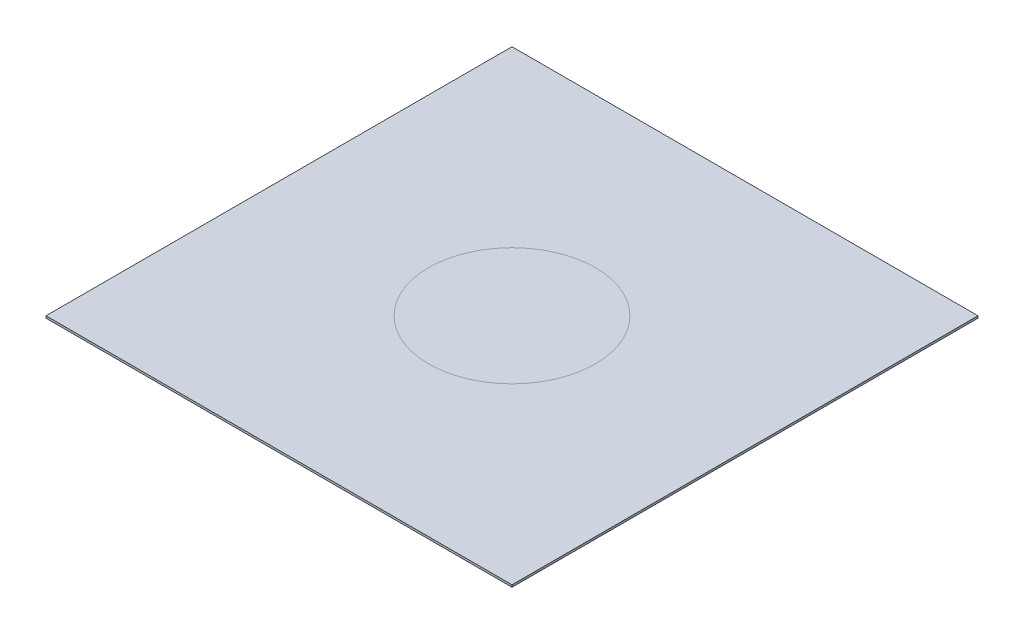
ISO-10303-21;
HEADER;
FILE_DESCRIPTION(('STEP AP214'),'2;1');
FILE_NAME('part.step','',(''),(''),'','','');
FILE_SCHEMA(('AUTOMOTIVE_DESIGN { 1 0 10303 214 1 1 1 1 }'));
ENDSEC;
DATA;
#1=APPLICATION_CONTEXT('core data for automotive mechanical design processes');
#2=APPLICATION_PROTOCOL_DEFINITION('international standard','automotive_design',2000,#1);
#3=PRODUCT_CONTEXT('',#1,'mechanical');
#4=PRODUCT('Part','Part','',(#3));
#5=PRODUCT_RELATED_PRODUCT_CATEGORY('part','',(#4));
#6=PRODUCT_DEFINITION_FORMATION('','',#4);
#7=PRODUCT_DEFINITION_CONTEXT('part definition',#1,'design');
#8=PRODUCT_DEFINITION('design','',#6,#7);
#9=PRODUCT_DEFINITION_SHAPE('','',#8);
#10=(LENGTH_UNIT() NAMED_UNIT(*) SI_UNIT(.MILLI.,.METRE.));
#11=(NAMED_UNIT(*) PLANE_ANGLE_UNIT() SI_UNIT($,.RADIAN.));
#12=(NAMED_UNIT(*) SI_UNIT($,.STERADIAN.) SOLID_ANGLE_UNIT());
#13=UNCERTAINTY_MEASURE_WITH_UNIT(LENGTH_MEASURE(1.E-05),#10,'distance_accuracy_value','');
#14=(GEOMETRIC_REPRESENTATION_CONTEXT(3) GLOBAL_UNCERTAINTY_ASSIGNED_CONTEXT((#13)) GLOBAL_UNIT_ASSIGNED_CONTEXT((#10,
#11,#12)) REPRESENTATION_CONTEXT('',''));
#15=CARTESIAN_POINT('',(0.,0.,0.));
#16=DIRECTION('',(0.,0.,1.));
#17=DIRECTION('',(1.,0.,0.));
#18=AXIS2_PLACEMENT_3D('',#15,#16,#17);
#19=CARTESIAN_POINT('',(0.,0.32,0.));
#20=DIRECTION('',(0.,-1.,0.));
#21=DIRECTION('',(0.,0.,-1.));
#22=AXIS2_PLACEMENT_3D('',#19,#20,#21);
#23=PLANE('',#22);
#24=DIRECTION('',(0.,0.,-1.));
#25=VECTOR('',#24,1.);
#26=CARTESIAN_POINT('',(69.85,0.32,69.85));
#27=LINE('',#26,#25);
#28=CARTESIAN_POINT('',(69.85,0.32,69.85));
#29=VERTEX_POINT('',#28);
#30=CARTESIAN_POINT('',(69.85,0.32,-69.85));
#31=VERTEX_POINT('',#30);
#32=EDGE_CURVE('E96',#29,#31,#27,.T.);
#33=ORIENTED_EDGE('',*,*,#32,.T.);
#34=DIRECTION('',(-1.,0.,0.));
#35=VECTOR('',#34,1.);
#36=CARTESIAN_POINT('',(-69.85,0.32,-69.85));
#37=LINE('',#36,#35);
#38=CARTESIAN_POINT('',(-69.85,0.32,-69.85));
#39=VERTEX_POINT('',#38);
#40=EDGE_CURVE('E91',#31,#39,#37,.T.);
#41=ORIENTED_EDGE('',*,*,#40,.T.);
#42=DIRECTION('',(0.,0.,1.));
#43=VECTOR('',#42,1.);
#44=CARTESIAN_POINT('',(-69.85,0.32,69.85));
#45=LINE('',#44,#43);
#46=CARTESIAN_POINT('',(-69.85,0.32,69.85));
#47=VERTEX_POINT('',#46);
#48=EDGE_CURVE('E94',#39,#47,#45,.T.);
#49=ORIENTED_EDGE('',*,*,#48,.T.);
#50=DIRECTION('',(1.,0.,0.));
#51=VECTOR('',#50,1.);
#52=CARTESIAN_POINT('',(-69.85,0.32,69.85));
#53=LINE('',#52,#51);
#54=EDGE_CURVE('E60',#47,#29,#53,.T.);
#55=ORIENTED_EDGE('',*,*,#54,.T.);
#56=EDGE_LOOP('',(#33,#41,#49,#55));
#57=FACE_BOUND('',#56,.T.);
#58=CARTESIAN_POINT('',(0.,0.32,0.));
#59=DIRECTION('',(0.,-1.,0.));
#60=DIRECTION('',(0.,0.,-1.));
#61=AXIS2_PLACEMENT_3D('',#58,#59,#60);
#62=CIRCLE('',#61,25.);
#63=CARTESIAN_POINT('',(0.,0.32,-25.));
#64=VERTEX_POINT('',#63);
#65=EDGE_CURVE('E11',#64,#64,#62,.F.);
#66=ORIENTED_EDGE('',*,*,#65,.F.);
#67=EDGE_LOOP('',(#66));
#68=FACE_BOUND('',#67,.T.);
#69=ADVANCED_FACE('F42',(#57,#68),#23,.F.);
#70=CARTESIAN_POINT('',(69.85,0.32,69.85));
#71=DIRECTION('',(-1.,0.,0.));
#72=DIRECTION('',(0.,0.,1.));
#73=AXIS2_PLACEMENT_3D('',#70,#71,#72);
#74=PLANE('',#73);
#75=DIRECTION('',(0.,0.,-1.));
#76=VECTOR('',#75,1.);
#77=CARTESIAN_POINT('',(69.85,-0.32,69.85));
#78=LINE('',#77,#76);
#79=CARTESIAN_POINT('',(69.85,-0.32,69.85));
#80=VERTEX_POINT('',#79);
#81=CARTESIAN_POINT('',(69.85,-0.32,-69.85));
#82=VERTEX_POINT('',#81);
#83=EDGE_CURVE('E110',#80,#82,#78,.T.);
#84=ORIENTED_EDGE('',*,*,#83,.T.);
#85=DIRECTION('',(0.,-1.,0.));
#86=VECTOR('',#85,1.);
#87=CARTESIAN_POINT('',(69.85,0.32,-69.85));
#88=LINE('',#87,#86);
#89=EDGE_CURVE('E52',#31,#82,#88,.T.);
#90=ORIENTED_EDGE('',*,*,#89,.F.);
#91=ORIENTED_EDGE('',*,*,#32,.F.);
#92=DIRECTION('',(0.,-1.,0.));
#93=VECTOR('',#92,1.);
#94=CARTESIAN_POINT('',(69.85,0.32,69.85));
#95=LINE('',#94,#93);
#96=EDGE_CURVE('E106',#29,#80,#95,.T.);
#97=ORIENTED_EDGE('',*,*,#96,.T.);
#98=EDGE_LOOP('',(#84,#90,#91,#97));
#99=FACE_BOUND('',#98,.T.);
#100=ADVANCED_FACE('F44',(#99),#74,.F.);
#101=CARTESIAN_POINT('',(-69.85,0.32,-69.85));
#102=DIRECTION('',(0.,0.,1.));
#103=DIRECTION('',(1.,0.,0.));
#104=AXIS2_PLACEMENT_3D('',#101,#102,#103);
#105=PLANE('',#104);
#106=DIRECTION('',(-1.,0.,0.));
#107=VECTOR('',#106,1.);
#108=CARTESIAN_POINT('',(-69.85,-0.32,-69.85));
#109=LINE('',#108,#107);
#110=CARTESIAN_POINT('',(-69.85,-0.32,-69.85));
#111=VERTEX_POINT('',#110);
#112=EDGE_CURVE('E101',#82,#111,#109,.T.);
#113=ORIENTED_EDGE('',*,*,#112,.T.);
#114=DIRECTION('',(0.,-1.,0.));
#115=VECTOR('',#114,1.);
#116=CARTESIAN_POINT('',(-69.85,0.32,-69.85));
#117=LINE('',#116,#115);
#118=EDGE_CURVE('E99',#39,#111,#117,.T.);
#119=ORIENTED_EDGE('',*,*,#118,.F.);
#120=ORIENTED_EDGE('',*,*,#40,.F.);
#121=ORIENTED_EDGE('',*,*,#89,.T.);
#122=EDGE_LOOP('',(#113,#119,#120,#121));
#123=FACE_BOUND('',#122,.T.);
#124=ADVANCED_FACE('F100',(#123),#105,.F.);
#125=CARTESIAN_POINT('',(-69.85,0.32,69.85));
#126=DIRECTION('',(1.,0.,0.));
#127=DIRECTION('',(0.,0.,-1.));
#128=AXIS2_PLACEMENT_3D('',#125,#126,#127);
#129=PLANE('',#128);
#130=DIRECTION('',(0.,0.,1.));
#131=VECTOR('',#130,1.);
#132=CARTESIAN_POINT('',(-69.85,-0.32,69.85));
#133=LINE('',#132,#131);
#134=CARTESIAN_POINT('',(-69.85,-0.32,69.85));
#135=VERTEX_POINT('',#134);
#136=EDGE_CURVE('E77',#111,#135,#133,.T.);
#137=ORIENTED_EDGE('',*,*,#136,.T.);
#138=DIRECTION('',(0.,-1.,0.));
#139=VECTOR('',#138,1.);
#140=CARTESIAN_POINT('',(-69.85,0.32,69.85));
#141=LINE('',#140,#139);
#142=EDGE_CURVE('E102',#47,#135,#141,.T.);
#143=ORIENTED_EDGE('',*,*,#142,.F.);
#144=ORIENTED_EDGE('',*,*,#48,.F.);
#145=ORIENTED_EDGE('',*,*,#118,.T.);
#146=EDGE_LOOP('',(#137,#143,#144,#145));
#147=FACE_BOUND('',#146,.T.);
#148=ADVANCED_FACE('F104',(#147),#129,.F.);
#149=CARTESIAN_POINT('',(-69.85,0.32,69.85));
#150=DIRECTION('',(0.,0.,-1.));
#151=DIRECTION('',(-1.,0.,0.));
#152=AXIS2_PLACEMENT_3D('',#149,#150,#151);
#153=PLANE('',#152);
#154=DIRECTION('',(1.,0.,0.));
#155=VECTOR('',#154,1.);
#156=CARTESIAN_POINT('',(-69.85,-0.32,69.85));
#157=LINE('',#156,#155);
#158=EDGE_CURVE('E83',#135,#80,#157,.T.);
#159=ORIENTED_EDGE('',*,*,#158,.T.);
#160=ORIENTED_EDGE('',*,*,#96,.F.);
#161=ORIENTED_EDGE('',*,*,#54,.F.);
#162=ORIENTED_EDGE('',*,*,#142,.T.);
#163=EDGE_LOOP('',(#159,#160,#161,#162));
#164=FACE_BOUND('',#163,.T.);
#165=ADVANCED_FACE('F127',(#164),#153,.F.);
#166=ORIENTED_EDGE('',*,*,#65,.T.);
#167=EDGE_LOOP('',(#166));
#168=FACE_BOUND('',#167,.T.);
#169=ADVANCED_FACE('F122',(#168),#23,.F.);
#170=CARTESIAN_POINT('',(0.,-0.32,0.));
#171=DIRECTION('',(0.,-1.,0.));
#172=DIRECTION('',(0.,0.,-1.));
#173=AXIS2_PLACEMENT_3D('',#170,#171,#172);
#174=PLANE('',#173);
#175=ORIENTED_EDGE('',*,*,#83,.F.);
#176=ORIENTED_EDGE('',*,*,#158,.F.);
#177=ORIENTED_EDGE('',*,*,#136,.F.);
#178=ORIENTED_EDGE('',*,*,#112,.F.);
#179=EDGE_LOOP('',(#175,#176,#177,#178));
#180=FACE_BOUND('',#179,.T.);
#181=ADVANCED_FACE('F120',(#180),#174,.T.);
#182=CLOSED_SHELL('',(#69,#100,#124,#148,#165,#169,#181));
#183=MANIFOLD_SOLID_BREP('B2',#182);
#184=ADVANCED_BREP_SHAPE_REPRESENTATION('',(#18,#183),#14);
#185=SHAPE_DEFINITION_REPRESENTATION(#9,#184);
ENDSEC;
END-ISO-10303-21;
